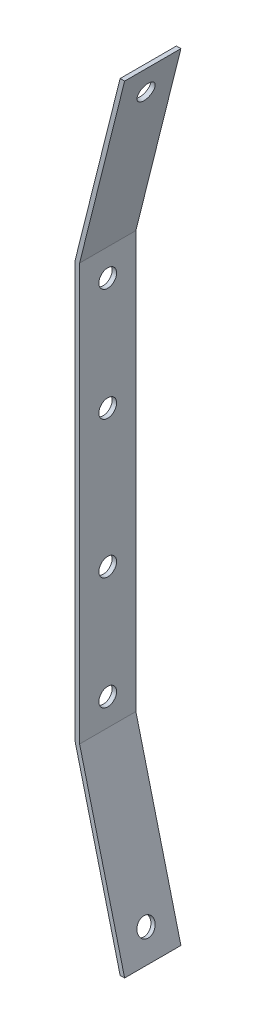
ISO-10303-21;
HEADER;
FILE_DESCRIPTION(('STEP AP214'),'2;1');
FILE_NAME('part.step','',(''),(''),'','','');
FILE_SCHEMA(('AUTOMOTIVE_DESIGN { 1 0 10303 214 1 1 1 1 }'));
ENDSEC;
DATA;
#1=APPLICATION_CONTEXT('core data for automotive mechanical design processes');
#2=APPLICATION_PROTOCOL_DEFINITION('international standard','automotive_design',2000,#1);
#3=PRODUCT_CONTEXT('',#1,'mechanical');
#4=PRODUCT('Part','Part','',(#3));
#5=PRODUCT_RELATED_PRODUCT_CATEGORY('part','',(#4));
#6=PRODUCT_DEFINITION_FORMATION('','',#4);
#7=PRODUCT_DEFINITION_CONTEXT('part definition',#1,'design');
#8=PRODUCT_DEFINITION('design','',#6,#7);
#9=PRODUCT_DEFINITION_SHAPE('','',#8);
#10=(LENGTH_UNIT() NAMED_UNIT(*) SI_UNIT(.MILLI.,.METRE.));
#11=(NAMED_UNIT(*) PLANE_ANGLE_UNIT() SI_UNIT($,.RADIAN.));
#12=(NAMED_UNIT(*) SI_UNIT($,.STERADIAN.) SOLID_ANGLE_UNIT());
#13=UNCERTAINTY_MEASURE_WITH_UNIT(LENGTH_MEASURE(1.E-05),#10,'distance_accuracy_value','');
#14=(GEOMETRIC_REPRESENTATION_CONTEXT(3) GLOBAL_UNCERTAINTY_ASSIGNED_CONTEXT((#13)) GLOBAL_UNIT_ASSIGNED_CONTEXT((#10,
#11,#12)) REPRESENTATION_CONTEXT('',''));
#15=CARTESIAN_POINT('',(0.,0.,0.));
#16=DIRECTION('',(0.,0.,1.));
#17=DIRECTION('',(1.,0.,0.));
#18=AXIS2_PLACEMENT_3D('',#15,#16,#17);
#19=CARTESIAN_POINT('',(0.,0.,6.35));
#20=DIRECTION('',(-1.,0.,0.));
#21=DIRECTION('',(0.,0.,1.));
#22=AXIS2_PLACEMENT_3D('',#19,#20,#21);
#23=PLANE('',#22);
#24=CARTESIAN_POINT('',(0.,15.748,3.175));
#25=DIRECTION('',(-1.,0.,0.));
#26=DIRECTION('',(0.,0.,1.));
#27=AXIS2_PLACEMENT_3D('',#24,#25,#26);
#28=CIRCLE('',#27,1.);
#29=CARTESIAN_POINT('',(0.,15.748,4.175));
#30=VERTEX_POINT('',#29);
#31=EDGE_CURVE('E165',#30,#30,#28,.T.);
#32=ORIENTED_EDGE('',*,*,#31,.F.);
#33=EDGE_LOOP('',(#32));
#34=FACE_BOUND('',#33,.T.);
#35=CARTESIAN_POINT('',(0.,43.942,3.175));
#36=DIRECTION('',(-1.,0.,0.));
#37=DIRECTION('',(0.,0.,1.));
#38=AXIS2_PLACEMENT_3D('',#35,#36,#37);
#39=CIRCLE('',#38,1.);
#40=CARTESIAN_POINT('',(0.,43.942,4.175));
#41=VERTEX_POINT('',#40);
#42=EDGE_CURVE('E225',#41,#41,#39,.T.);
#43=ORIENTED_EDGE('',*,*,#42,.F.);
#44=EDGE_LOOP('',(#43));
#45=FACE_BOUND('',#44,.T.);
#46=CARTESIAN_POINT('',(0.,31.242,3.175));
#47=DIRECTION('',(-1.,0.,0.));
#48=DIRECTION('',(0.,0.,1.));
#49=AXIS2_PLACEMENT_3D('',#46,#47,#48);
#50=CIRCLE('',#49,0.999999999999999);
#51=CARTESIAN_POINT('',(0.,31.242,4.175));
#52=VERTEX_POINT('',#51);
#53=EDGE_CURVE('E178',#52,#52,#50,.T.);
#54=ORIENTED_EDGE('',*,*,#53,.F.);
#55=EDGE_LOOP('',(#54));
#56=FACE_BOUND('',#55,.T.);
#57=CARTESIAN_POINT('',(0.,3.048,3.175));
#58=DIRECTION('',(-1.,0.,0.));
#59=DIRECTION('',(0.,0.,1.));
#60=AXIS2_PLACEMENT_3D('',#57,#58,#59);
#61=CIRCLE('',#60,1.);
#62=CARTESIAN_POINT('',(0.,3.048,4.175));
#63=VERTEX_POINT('',#62);
#64=EDGE_CURVE('E161',#63,#63,#61,.T.);
#65=ORIENTED_EDGE('',*,*,#64,.F.);
#66=EDGE_LOOP('',(#65));
#67=FACE_BOUND('',#66,.T.);
#68=DIRECTION('',(0.,1.,0.));
#69=VECTOR('',#68,1.);
#70=CARTESIAN_POINT('',(0.,0.,0.));
#71=LINE('',#70,#69);
#72=CARTESIAN_POINT('',(0.,0.,0.));
#73=VERTEX_POINT('',#72);
#74=CARTESIAN_POINT('',(0.,46.99,0.));
#75=VERTEX_POINT('',#74);
#76=EDGE_CURVE('E130',#73,#75,#71,.T.);
#77=ORIENTED_EDGE('',*,*,#76,.F.);
#78=DIRECTION('',(0.,0.,-1.));
#79=VECTOR('',#78,1.);
#80=CARTESIAN_POINT('',(0.,0.,6.35));
#81=LINE('',#80,#79);
#82=CARTESIAN_POINT('',(0.,0.,6.35));
#83=VERTEX_POINT('',#82);
#84=EDGE_CURVE('E11',#83,#73,#81,.T.);
#85=ORIENTED_EDGE('',*,*,#84,.F.);
#86=DIRECTION('',(0.,1.,0.));
#87=VECTOR('',#86,1.);
#88=CARTESIAN_POINT('',(0.,0.,6.35));
#89=LINE('',#88,#87);
#90=CARTESIAN_POINT('',(0.,46.99,6.35));
#91=VERTEX_POINT('',#90);
#92=EDGE_CURVE('E147',#83,#91,#89,.T.);
#93=ORIENTED_EDGE('',*,*,#92,.T.);
#94=DIRECTION('',(0.,0.,-1.));
#95=VECTOR('',#94,1.);
#96=CARTESIAN_POINT('',(0.,46.99,6.35));
#97=LINE('',#96,#95);
#98=EDGE_CURVE('E52',#91,#75,#97,.T.);
#99=ORIENTED_EDGE('',*,*,#98,.T.);
#100=EDGE_LOOP('',(#77,#85,#93,#99));
#101=FACE_BOUND('',#100,.T.);
#102=ADVANCED_FACE('F34',(#34,#45,#56,#67,#101),#23,.T.);
#103=CARTESIAN_POINT('',(0.,0.,6.35));
#104=DIRECTION('',(0.970142500145332,0.242535625036333,0.));
#105=DIRECTION('',(-0.242535625036333,0.970142500145332,0.));
#106=AXIS2_PLACEMENT_3D('',#103,#104,#105);
#107=PLANE('',#106);
#108=CARTESIAN_POINT('',(4.352393124891,-17.409572499564,3.175));
#109=DIRECTION('',(0.970142500145332,0.242535625036333,0.));
#110=DIRECTION('',(-0.242535625036333,0.970142500145332,0.));
#111=AXIS2_PLACEMENT_3D('',#108,#109,#110);
#112=CIRCLE('',#111,1.);
#113=CARTESIAN_POINT('',(4.10985749985467,-16.4394299994187,3.175));
#114=VERTEX_POINT('',#113);
#115=EDGE_CURVE('E237',#114,#114,#112,.T.);
#116=ORIENTED_EDGE('',*,*,#115,.T.);
#117=EDGE_LOOP('',(#116));
#118=FACE_BOUND('',#117,.T.);
#119=DIRECTION('',(0.242535625036333,-0.970142500145332,0.));
#120=VECTOR('',#119,1.);
#121=CARTESIAN_POINT('',(0.,0.,0.));
#122=LINE('',#121,#120);
#123=CARTESIAN_POINT('',(5.08,-20.32,0.));
#124=VERTEX_POINT('',#123);
#125=EDGE_CURVE('E132',#73,#124,#122,.T.);
#126=ORIENTED_EDGE('',*,*,#125,.T.);
#127=DIRECTION('',(0.,0.,-1.));
#128=VECTOR('',#127,1.);
#129=CARTESIAN_POINT('',(5.08,-20.32,6.35));
#130=LINE('',#129,#128);
#131=CARTESIAN_POINT('',(5.08,-20.32,6.35));
#132=VERTEX_POINT('',#131);
#133=EDGE_CURVE('E43',#132,#124,#130,.T.);
#134=ORIENTED_EDGE('',*,*,#133,.F.);
#135=DIRECTION('',(0.242535625036333,-0.970142500145332,0.));
#136=VECTOR('',#135,1.);
#137=CARTESIAN_POINT('',(0.,0.,6.35));
#138=LINE('',#137,#136);
#139=EDGE_CURVE('E181',#83,#132,#138,.T.);
#140=ORIENTED_EDGE('',*,*,#139,.F.);
#141=ORIENTED_EDGE('',*,*,#84,.T.);
#142=EDGE_LOOP('',(#126,#134,#140,#141));
#143=FACE_BOUND('',#142,.T.);
#144=ADVANCED_FACE('F212',(#118,#143),#107,.F.);
#145=CARTESIAN_POINT('',(0.,-20.32,6.35));
#146=DIRECTION('',(0.,1.,0.));
#147=DIRECTION('',(0.,0.,1.));
#148=AXIS2_PLACEMENT_3D('',#145,#146,#147);
#149=PLANE('',#148);
#150=DIRECTION('',(1.,0.,0.));
#151=VECTOR('',#150,1.);
#152=CARTESIAN_POINT('',(0.,-20.32,0.));
#153=LINE('',#152,#151);
#154=CARTESIAN_POINT('',(5.588,-20.32,0.));
#155=VERTEX_POINT('',#154);
#156=EDGE_CURVE('E135',#124,#155,#153,.T.);
#157=ORIENTED_EDGE('',*,*,#156,.T.);
#158=DIRECTION('',(0.,0.,-1.));
#159=VECTOR('',#158,1.);
#160=CARTESIAN_POINT('',(5.588,-20.32,6.35));
#161=LINE('',#160,#159);
#162=CARTESIAN_POINT('',(5.588,-20.32,6.35));
#163=VERTEX_POINT('',#162);
#164=EDGE_CURVE('E154',#163,#155,#161,.T.);
#165=ORIENTED_EDGE('',*,*,#164,.F.);
#166=DIRECTION('',(1.,0.,0.));
#167=VECTOR('',#166,1.);
#168=CARTESIAN_POINT('',(0.,-20.32,6.35));
#169=LINE('',#168,#167);
#170=EDGE_CURVE('E183',#132,#163,#169,.T.);
#171=ORIENTED_EDGE('',*,*,#170,.F.);
#172=ORIENTED_EDGE('',*,*,#133,.T.);
#173=EDGE_LOOP('',(#157,#165,#171,#172));
#174=FACE_BOUND('',#173,.T.);
#175=ADVANCED_FACE('F217',(#174),#149,.F.);
#176=CARTESIAN_POINT('',(0.478117647058824,0.119529411764706,6.35));
#177=DIRECTION('',(-0.970142500145332,-0.242535625036333,0.));
#178=DIRECTION('',(0.242535625036333,-0.970142500145332,0.));
#179=AXIS2_PLACEMENT_3D('',#176,#177,#178);
#180=PLANE('',#179);
#181=CARTESIAN_POINT('',(4.83051077194983,-17.2900430877993,3.175));
#182=DIRECTION('',(0.970142500145332,0.242535625036333,0.));
#183=DIRECTION('',(-0.242535625036333,0.970142500145332,0.));
#184=AXIS2_PLACEMENT_3D('',#181,#182,#183);
#185=CIRCLE('',#184,1.);
#186=CARTESIAN_POINT('',(4.58797514691349,-16.319900587654,3.175));
#187=VERTEX_POINT('',#186);
#188=EDGE_CURVE('E341',#187,#187,#185,.T.);
#189=ORIENTED_EDGE('',*,*,#188,.F.);
#190=EDGE_LOOP('',(#189));
#191=FACE_BOUND('',#190,.T.);
#192=DIRECTION('',(-0.242535625036333,0.970142500145332,0.));
#193=VECTOR('',#192,1.);
#194=CARTESIAN_POINT('',(0.478117647058824,0.119529411764706,0.));
#195=LINE('',#194,#193);
#196=CARTESIAN_POINT('',(0.508,0.,0.));
#197=VERTEX_POINT('',#196);
#198=EDGE_CURVE('E137',#155,#197,#195,.T.);
#199=ORIENTED_EDGE('',*,*,#198,.T.);
#200=DIRECTION('',(0.,0.,-1.));
#201=VECTOR('',#200,1.);
#202=CARTESIAN_POINT('',(0.508,0.,6.35));
#203=LINE('',#202,#201);
#204=CARTESIAN_POINT('',(0.508,0.,6.35));
#205=VERTEX_POINT('',#204);
#206=EDGE_CURVE('E151',#205,#197,#203,.T.);
#207=ORIENTED_EDGE('',*,*,#206,.F.);
#208=DIRECTION('',(-0.242535625036333,0.970142500145332,0.));
#209=VECTOR('',#208,1.);
#210=CARTESIAN_POINT('',(0.478117647058824,0.119529411764706,6.35));
#211=LINE('',#210,#209);
#212=EDGE_CURVE('E185',#163,#205,#211,.T.);
#213=ORIENTED_EDGE('',*,*,#212,.F.);
#214=ORIENTED_EDGE('',*,*,#164,.T.);
#215=EDGE_LOOP('',(#199,#207,#213,#214));
#216=FACE_BOUND('',#215,.T.);
#217=ADVANCED_FACE('F191',(#191,#216),#180,.F.);
#218=CARTESIAN_POINT('',(0.508,0.,6.35));
#219=DIRECTION('',(-1.,0.,0.));
#220=DIRECTION('',(0.,0.,1.));
#221=AXIS2_PLACEMENT_3D('',#218,#219,#220);
#222=PLANE('',#221);
#223=CARTESIAN_POINT('',(0.508,15.748,3.175));
#224=DIRECTION('',(-1.,0.,0.));
#225=DIRECTION('',(0.,0.,1.));
#226=AXIS2_PLACEMENT_3D('',#223,#224,#225);
#227=CIRCLE('',#226,1.);
#228=CARTESIAN_POINT('',(0.508,15.748,4.175));
#229=VERTEX_POINT('',#228);
#230=EDGE_CURVE('E37',#229,#229,#227,.T.);
#231=ORIENTED_EDGE('',*,*,#230,.T.);
#232=EDGE_LOOP('',(#231));
#233=FACE_BOUND('',#232,.T.);
#234=CARTESIAN_POINT('',(0.508,43.942,3.175));
#235=DIRECTION('',(-1.,0.,0.));
#236=DIRECTION('',(0.,0.,1.));
#237=AXIS2_PLACEMENT_3D('',#234,#235,#236);
#238=CIRCLE('',#237,1.);
#239=CARTESIAN_POINT('',(0.508,43.942,4.175));
#240=VERTEX_POINT('',#239);
#241=EDGE_CURVE('E164',#240,#240,#238,.T.);
#242=ORIENTED_EDGE('',*,*,#241,.T.);
#243=EDGE_LOOP('',(#242));
#244=FACE_BOUND('',#243,.T.);
#245=CARTESIAN_POINT('',(0.508,31.242,3.175));
#246=DIRECTION('',(-1.,0.,0.));
#247=DIRECTION('',(0.,0.,1.));
#248=AXIS2_PLACEMENT_3D('',#245,#246,#247);
#249=CIRCLE('',#248,0.999999999999999);
#250=CARTESIAN_POINT('',(0.508,31.242,4.175));
#251=VERTEX_POINT('',#250);
#252=EDGE_CURVE('E162',#251,#251,#249,.T.);
#253=ORIENTED_EDGE('',*,*,#252,.T.);
#254=EDGE_LOOP('',(#253));
#255=FACE_BOUND('',#254,.T.);
#256=CARTESIAN_POINT('',(0.508,3.048,3.175));
#257=DIRECTION('',(-1.,0.,0.));
#258=DIRECTION('',(0.,0.,1.));
#259=AXIS2_PLACEMENT_3D('',#256,#257,#258);
#260=CIRCLE('',#259,1.);
#261=CARTESIAN_POINT('',(0.508,3.048,4.175));
#262=VERTEX_POINT('',#261);
#263=EDGE_CURVE('E133',#262,#262,#260,.T.);
#264=ORIENTED_EDGE('',*,*,#263,.T.);
#265=EDGE_LOOP('',(#264));
#266=FACE_BOUND('',#265,.T.);
#267=DIRECTION('',(0.,1.,0.));
#268=VECTOR('',#267,1.);
#269=CARTESIAN_POINT('',(0.508,0.,0.));
#270=LINE('',#269,#268);
#271=CARTESIAN_POINT('',(0.508,46.99,0.));
#272=VERTEX_POINT('',#271);
#273=EDGE_CURVE('E139',#197,#272,#270,.T.);
#274=ORIENTED_EDGE('',*,*,#273,.T.);
#275=DIRECTION('',(0.,0.,-1.));
#276=VECTOR('',#275,1.);
#277=CARTESIAN_POINT('',(0.508,46.99,6.35));
#278=LINE('',#277,#276);
#279=CARTESIAN_POINT('',(0.508,46.99,6.35));
#280=VERTEX_POINT('',#279);
#281=EDGE_CURVE('E122',#280,#272,#278,.T.);
#282=ORIENTED_EDGE('',*,*,#281,.F.);
#283=DIRECTION('',(0.,1.,0.));
#284=VECTOR('',#283,1.);
#285=CARTESIAN_POINT('',(0.508,0.,6.35));
#286=LINE('',#285,#284);
#287=EDGE_CURVE('E110',#205,#280,#286,.T.);
#288=ORIENTED_EDGE('',*,*,#287,.F.);
#289=ORIENTED_EDGE('',*,*,#206,.T.);
#290=EDGE_LOOP('',(#274,#282,#288,#289));
#291=FACE_BOUND('',#290,.T.);
#292=ADVANCED_FACE('F195',(#233,#244,#255,#266,#291),#222,.F.);
#293=CARTESIAN_POINT('',(-10.5783529411765,2.64458823529412,6.35));
#294=DIRECTION('',(-0.970142500145332,0.242535625036333,0.));
#295=DIRECTION('',(-0.242535625036333,-0.970142500145332,0.));
#296=AXIS2_PLACEMENT_3D('',#293,#294,#295);
#297=PLANE('',#296);
#298=CARTESIAN_POINT('',(4.83051077194983,64.2800430877993,3.175));
#299=DIRECTION('',(-0.970142500145332,0.242535625036333,0.));
#300=DIRECTION('',(-0.242535625036333,-0.970142500145332,0.));
#301=AXIS2_PLACEMENT_3D('',#298,#299,#300);
#302=CIRCLE('',#301,0.999999999999999);
#303=CARTESIAN_POINT('',(4.5879751469135,63.309900587654,3.175));
#304=VERTEX_POINT('',#303);
#305=EDGE_CURVE('E230',#304,#304,#302,.T.);
#306=ORIENTED_EDGE('',*,*,#305,.T.);
#307=EDGE_LOOP('',(#306));
#308=FACE_BOUND('',#307,.T.);
#309=DIRECTION('',(0.242535625036333,0.970142500145332,0.));
#310=VECTOR('',#309,1.);
#311=CARTESIAN_POINT('',(-10.5783529411765,2.64458823529412,0.));
#312=LINE('',#311,#310);
#313=CARTESIAN_POINT('',(5.588,67.31,0.));
#314=VERTEX_POINT('',#313);
#315=EDGE_CURVE('E119',#272,#314,#312,.T.);
#316=ORIENTED_EDGE('',*,*,#315,.T.);
#317=DIRECTION('',(0.,0.,-1.));
#318=VECTOR('',#317,1.);
#319=CARTESIAN_POINT('',(5.588,67.31,6.35));
#320=LINE('',#319,#318);
#321=CARTESIAN_POINT('',(5.588,67.31,6.35));
#322=VERTEX_POINT('',#321);
#323=EDGE_CURVE('E116',#322,#314,#320,.T.);
#324=ORIENTED_EDGE('',*,*,#323,.F.);
#325=DIRECTION('',(0.242535625036333,0.970142500145332,0.));
#326=VECTOR('',#325,1.);
#327=CARTESIAN_POINT('',(-10.5783529411765,2.64458823529412,6.35));
#328=LINE('',#327,#326);
#329=EDGE_CURVE('E102',#280,#322,#328,.T.);
#330=ORIENTED_EDGE('',*,*,#329,.F.);
#331=ORIENTED_EDGE('',*,*,#281,.T.);
#332=EDGE_LOOP('',(#316,#324,#330,#331));
#333=FACE_BOUND('',#332,.T.);
#334=ADVANCED_FACE('F117',(#308,#333),#297,.F.);
#335=CARTESIAN_POINT('',(1.67164262230492E-13,67.31,6.35));
#336=DIRECTION('',(0.,-1.,0.));
#337=DIRECTION('',(1.,0.,0.));
#338=AXIS2_PLACEMENT_3D('',#335,#336,#337);
#339=PLANE('',#338);
#340=DIRECTION('',(-1.,0.,0.));
#341=VECTOR('',#340,1.);
#342=CARTESIAN_POINT('',(1.67164262230492E-13,67.31,0.));
#343=LINE('',#342,#341);
#344=CARTESIAN_POINT('',(5.08000000000001,67.31,0.));
#345=VERTEX_POINT('',#344);
#346=EDGE_CURVE('E142',#314,#345,#343,.T.);
#347=ORIENTED_EDGE('',*,*,#346,.T.);
#348=DIRECTION('',(0.,0.,-1.));
#349=VECTOR('',#348,1.);
#350=CARTESIAN_POINT('',(5.08000000000001,67.31,6.35));
#351=LINE('',#350,#349);
#352=CARTESIAN_POINT('',(5.08000000000001,67.31,6.35));
#353=VERTEX_POINT('',#352);
#354=EDGE_CURVE('E78',#353,#345,#351,.T.);
#355=ORIENTED_EDGE('',*,*,#354,.F.);
#356=DIRECTION('',(-1.,0.,0.));
#357=VECTOR('',#356,1.);
#358=CARTESIAN_POINT('',(1.67164262230492E-13,67.31,6.35));
#359=LINE('',#358,#357);
#360=EDGE_CURVE('E108',#322,#353,#359,.T.);
#361=ORIENTED_EDGE('',*,*,#360,.F.);
#362=ORIENTED_EDGE('',*,*,#323,.T.);
#363=EDGE_LOOP('',(#347,#355,#361,#362));
#364=FACE_BOUND('',#363,.T.);
#365=ADVANCED_FACE('F124',(#364),#339,.F.);
#366=CARTESIAN_POINT('',(-11.0564705882353,2.76411764705883,6.35));
#367=DIRECTION('',(-0.970142500145332,0.242535625036333,0.));
#368=DIRECTION('',(-0.242535625036333,-0.970142500145332,0.));
#369=AXIS2_PLACEMENT_3D('',#366,#367,#368);
#370=PLANE('',#369);
#371=CARTESIAN_POINT('',(4.35239312489101,64.399572499564,3.175));
#372=DIRECTION('',(-0.970142500145332,0.242535625036333,0.));
#373=DIRECTION('',(-0.242535625036333,-0.970142500145332,0.));
#374=AXIS2_PLACEMENT_3D('',#371,#372,#373);
#375=CIRCLE('',#374,0.999999999999999);
#376=CARTESIAN_POINT('',(4.10985749985467,63.4294299994187,3.175));
#377=VERTEX_POINT('',#376);
#378=EDGE_CURVE('E232',#377,#377,#375,.T.);
#379=ORIENTED_EDGE('',*,*,#378,.F.);
#380=EDGE_LOOP('',(#379));
#381=FACE_BOUND('',#380,.T.);
#382=DIRECTION('',(0.242535625036333,0.970142500145332,0.));
#383=VECTOR('',#382,1.);
#384=CARTESIAN_POINT('',(-11.0564705882353,2.76411764705883,0.));
#385=LINE('',#384,#383);
#386=EDGE_CURVE('E144',#75,#345,#385,.T.);
#387=ORIENTED_EDGE('',*,*,#386,.F.);
#388=ORIENTED_EDGE('',*,*,#98,.F.);
#389=DIRECTION('',(0.242535625036333,0.970142500145332,0.));
#390=VECTOR('',#389,1.);
#391=CARTESIAN_POINT('',(-11.0564705882353,2.76411764705883,6.35));
#392=LINE('',#391,#390);
#393=EDGE_CURVE('E125',#91,#353,#392,.T.);
#394=ORIENTED_EDGE('',*,*,#393,.T.);
#395=ORIENTED_EDGE('',*,*,#354,.T.);
#396=EDGE_LOOP('',(#387,#388,#394,#395));
#397=FACE_BOUND('',#396,.T.);
#398=ADVANCED_FACE('F199',(#381,#397),#370,.T.);
#399=CARTESIAN_POINT('',(0.,0.,6.35));
#400=DIRECTION('',(0.,0.,1.));
#401=DIRECTION('',(1.,0.,0.));
#402=AXIS2_PLACEMENT_3D('',#399,#400,#401);
#403=PLANE('',#402);
#404=ORIENTED_EDGE('',*,*,#92,.F.);
#405=ORIENTED_EDGE('',*,*,#139,.T.);
#406=ORIENTED_EDGE('',*,*,#170,.T.);
#407=ORIENTED_EDGE('',*,*,#212,.T.);
#408=ORIENTED_EDGE('',*,*,#287,.T.);
#409=ORIENTED_EDGE('',*,*,#329,.T.);
#410=ORIENTED_EDGE('',*,*,#360,.T.);
#411=ORIENTED_EDGE('',*,*,#393,.F.);
#412=EDGE_LOOP('',(#404,#405,#406,#407,#408,#409,#410,#411));
#413=FACE_BOUND('',#412,.T.);
#414=ADVANCED_FACE('F105',(#413),#403,.T.);
#415=CARTESIAN_POINT('',(0.,0.,0.));
#416=DIRECTION('',(0.,0.,1.));
#417=DIRECTION('',(1.,0.,0.));
#418=AXIS2_PLACEMENT_3D('',#415,#416,#417);
#419=PLANE('',#418);
#420=ORIENTED_EDGE('',*,*,#76,.T.);
#421=ORIENTED_EDGE('',*,*,#386,.T.);
#422=ORIENTED_EDGE('',*,*,#346,.F.);
#423=ORIENTED_EDGE('',*,*,#315,.F.);
#424=ORIENTED_EDGE('',*,*,#273,.F.);
#425=ORIENTED_EDGE('',*,*,#198,.F.);
#426=ORIENTED_EDGE('',*,*,#156,.F.);
#427=ORIENTED_EDGE('',*,*,#125,.F.);
#428=EDGE_LOOP('',(#420,#421,#422,#423,#424,#425,#426,#427));
#429=FACE_BOUND('',#428,.T.);
#430=ADVANCED_FACE('F197',(#429),#419,.F.);
#431=CARTESIAN_POINT('',(6.35,3.048,3.175));
#432=DIRECTION('',(-1.,0.,0.));
#433=DIRECTION('',(0.,0.,1.));
#434=AXIS2_PLACEMENT_3D('',#431,#432,#433);
#435=CYLINDRICAL_SURFACE('',#434,1.);
#436=ORIENTED_EDGE('',*,*,#64,.T.);
#437=EDGE_LOOP('',(#436));
#438=FACE_BOUND('',#437,.T.);
#439=ORIENTED_EDGE('',*,*,#263,.F.);
#440=EDGE_LOOP('',(#439));
#441=FACE_BOUND('',#440,.T.);
#442=ADVANCED_FACE('F262',(#438,#441),#435,.F.);
#443=CARTESIAN_POINT('',(6.35,31.242,3.175));
#444=DIRECTION('',(-1.,0.,0.));
#445=DIRECTION('',(0.,0.,1.));
#446=AXIS2_PLACEMENT_3D('',#443,#444,#445);
#447=CYLINDRICAL_SURFACE('',#446,0.999999999999999);
#448=ORIENTED_EDGE('',*,*,#53,.T.);
#449=EDGE_LOOP('',(#448));
#450=FACE_BOUND('',#449,.T.);
#451=ORIENTED_EDGE('',*,*,#252,.F.);
#452=EDGE_LOOP('',(#451));
#453=FACE_BOUND('',#452,.T.);
#454=ADVANCED_FACE('F255',(#450,#453),#447,.F.);
#455=CARTESIAN_POINT('',(6.35,43.942,3.175));
#456=DIRECTION('',(-1.,0.,0.));
#457=DIRECTION('',(0.,0.,1.));
#458=AXIS2_PLACEMENT_3D('',#455,#456,#457);
#459=CYLINDRICAL_SURFACE('',#458,1.);
#460=ORIENTED_EDGE('',*,*,#42,.T.);
#461=EDGE_LOOP('',(#460));
#462=FACE_BOUND('',#461,.T.);
#463=ORIENTED_EDGE('',*,*,#241,.F.);
#464=EDGE_LOOP('',(#463));
#465=FACE_BOUND('',#464,.T.);
#466=ADVANCED_FACE('F246',(#462,#465),#459,.F.);
#467=CARTESIAN_POINT('',(6.35,15.748,3.175));
#468=DIRECTION('',(-1.,0.,0.));
#469=DIRECTION('',(0.,0.,1.));
#470=AXIS2_PLACEMENT_3D('',#467,#468,#469);
#471=CYLINDRICAL_SURFACE('',#470,1.);
#472=ORIENTED_EDGE('',*,*,#31,.T.);
#473=EDGE_LOOP('',(#472));
#474=FACE_BOUND('',#473,.T.);
#475=ORIENTED_EDGE('',*,*,#230,.F.);
#476=EDGE_LOOP('',(#475));
#477=FACE_BOUND('',#476,.T.);
#478=ADVANCED_FACE('F242',(#474,#477),#471,.F.);
#479=CARTESIAN_POINT('',(10.5127980008139,62.8594712805833,3.175));
#480=DIRECTION('',(-0.970142500145332,0.242535625036333,0.));
#481=DIRECTION('',(-0.242535625036333,-0.970142500145332,0.));
#482=AXIS2_PLACEMENT_3D('',#479,#480,#481);
#483=CYLINDRICAL_SURFACE('',#482,0.999999999999999);
#484=ORIENTED_EDGE('',*,*,#378,.T.);
#485=EDGE_LOOP('',(#484));
#486=FACE_BOUND('',#485,.T.);
#487=ORIENTED_EDGE('',*,*,#305,.F.);
#488=EDGE_LOOP('',(#487));
#489=FACE_BOUND('',#488,.T.);
#490=ADVANCED_FACE('F245',(#486,#489),#483,.F.);
#491=CARTESIAN_POINT('',(2.36634882158068,-17.9060835753916,3.175));
#492=DIRECTION('',(0.970142500145332,0.242535625036333,0.));
#493=DIRECTION('',(-0.242535625036333,0.970142500145332,0.));
#494=AXIS2_PLACEMENT_3D('',#491,#492,#493);
#495=CYLINDRICAL_SURFACE('',#494,1.);
#496=CARTESIAN_POINT('',(4.58797514691349,-16.319900587654,3.175));
#497=CARTESIAN_POINT('',(4.58299475475663,-16.3211456856932,3.175));
#498=CARTESIAN_POINT('',(4.57801436259977,-16.3223907837324,3.175));
#499=CARTESIAN_POINT('',(4.56805357828604,-16.3248809798108,3.175));
#500=CARTESIAN_POINT('',(4.56307318612918,-16.32612607785,3.175));
#501=CARTESIAN_POINT('',(4.55311240181546,-16.3286162739285,3.175));
#502=CARTESIAN_POINT('',(4.54813200965859,-16.3298613719677,3.175));
#503=CARTESIAN_POINT('',(4.53817122534487,-16.3323515680461,3.175));
#504=CARTESIAN_POINT('',(4.533190833188,-16.3335966660853,3.175));
#505=CARTESIAN_POINT('',(4.52323004887428,-16.3360868621638,3.175));
#506=CARTESIAN_POINT('',(4.51824965671741,-16.337331960203,3.175));
#507=CARTESIAN_POINT('',(4.50828887240369,-16.3398221562814,3.175));
#508=CARTESIAN_POINT('',(4.50330848024683,-16.3410672543206,3.175));
#509=CARTESIAN_POINT('',(4.4933476959331,-16.3435574503991,3.175));
#510=CARTESIAN_POINT('',(4.48836730377624,-16.3448025484383,3.175));
#511=CARTESIAN_POINT('',(4.47840651946251,-16.3472927445167,3.175));
#512=CARTESIAN_POINT('',(4.47342612730565,-16.3485378425559,3.175));
#513=CARTESIAN_POINT('',(4.46346534299192,-16.3510280386344,3.175));
#514=CARTESIAN_POINT('',(4.45848495083506,-16.3522731366736,3.175));
#515=CARTESIAN_POINT('',(4.44852416652134,-16.354763332752,3.175));
#516=CARTESIAN_POINT('',(4.44354377436447,-16.3560084307912,3.175));
#517=CARTESIAN_POINT('',(4.43358299005075,-16.3584986268697,3.175));
#518=CARTESIAN_POINT('',(4.42860259789389,-16.3597437249089,3.175));
#519=CARTESIAN_POINT('',(4.41864181358016,-16.3622339209873,3.175));
#520=CARTESIAN_POINT('',(4.4136614214233,-16.3634790190265,3.175));
#521=CARTESIAN_POINT('',(4.40370063710957,-16.365969215105,3.175));
#522=CARTESIAN_POINT('',(4.39872024495271,-16.3672143131442,3.175));
#523=CARTESIAN_POINT('',(4.38875946063898,-16.3697045092226,3.175));
#524=CARTESIAN_POINT('',(4.38377906848212,-16.3709496072618,3.175));
#525=CARTESIAN_POINT('',(4.3738182841684,-16.3734398033402,3.175));
#526=CARTESIAN_POINT('',(4.36883789201153,-16.3746849013795,3.175));
#527=CARTESIAN_POINT('',(4.35887710769781,-16.3771750974579,3.175));
#528=CARTESIAN_POINT('',(4.35389671554094,-16.3784201954971,3.175));
#529=CARTESIAN_POINT('',(4.34393593122722,-16.3809103915755,3.175));
#530=CARTESIAN_POINT('',(4.33895553907036,-16.3821554896148,3.175));
#531=CARTESIAN_POINT('',(4.32899475475663,-16.3846456856932,3.175));
#532=CARTESIAN_POINT('',(4.32401436259977,-16.3858907837324,3.175));
#533=CARTESIAN_POINT('',(4.31405357828604,-16.3883809798108,3.175));
#534=CARTESIAN_POINT('',(4.30907318612918,-16.38962607785,3.175));
#535=CARTESIAN_POINT('',(4.29911240181545,-16.3921162739285,3.175));
#536=CARTESIAN_POINT('',(4.29413200965859,-16.3933613719677,3.175));
#537=CARTESIAN_POINT('',(4.28417122534487,-16.3958515680461,3.175));
#538=CARTESIAN_POINT('',(4.279190833188,-16.3970966660853,3.175));
#539=CARTESIAN_POINT('',(4.26923004887428,-16.3995868621638,3.175));
#540=CARTESIAN_POINT('',(4.26424965671742,-16.400831960203,3.175));
#541=CARTESIAN_POINT('',(4.25428887240369,-16.4033221562814,3.175));
#542=CARTESIAN_POINT('',(4.24930848024683,-16.4045672543206,3.175));
#543=CARTESIAN_POINT('',(4.2393476959331,-16.4070574503991,3.175));
#544=CARTESIAN_POINT('',(4.23436730377624,-16.4083025484383,3.175));
#545=CARTESIAN_POINT('',(4.22440651946251,-16.4107927445167,3.175));
#546=CARTESIAN_POINT('',(4.21942612730565,-16.4120378425559,3.175));
#547=CARTESIAN_POINT('',(4.20946534299192,-16.4145280386344,3.175));
#548=CARTESIAN_POINT('',(4.20448495083506,-16.4157731366736,3.175));
#549=CARTESIAN_POINT('',(4.19452416652134,-16.418263332752,3.175));
#550=CARTESIAN_POINT('',(4.18954377436447,-16.4195084307912,3.175));
#551=CARTESIAN_POINT('',(4.17958299005075,-16.4219986268697,3.175));
#552=CARTESIAN_POINT('',(4.17460259789389,-16.4232437249089,3.175));
#553=CARTESIAN_POINT('',(4.16464181358016,-16.4257339209873,3.175));
#554=CARTESIAN_POINT('',(4.1596614214233,-16.4269790190265,3.175));
#555=CARTESIAN_POINT('',(4.14970063710957,-16.4294692151049,3.175));
#556=CARTESIAN_POINT('',(4.14472024495271,-16.4307143131442,3.175));
#557=CARTESIAN_POINT('',(4.13475946063898,-16.4332045092226,3.175));
#558=CARTESIAN_POINT('',(4.12977906848212,-16.4344496072618,3.175));
#559=CARTESIAN_POINT('',(4.1198182841684,-16.4369398033402,3.175));
#560=CARTESIAN_POINT('',(4.11483789201153,-16.4381849013795,3.175));
#561=CARTESIAN_POINT('',(4.10985749985467,-16.4394299994187,3.175));
#562=B_SPLINE_CURVE_WITH_KNOTS('',3,(#496,#497,#498,#499,#500,#501,#502,#503,#504,#505,#506,
#507,#508,#509,#510,#511,#512,#513,#514,#515,#516,#517,#518,#519,#520,#521,#522,#523,#524,#525,
#526,#527,#528,#529,#530,#531,#532,#533,#534,#535,#536,#537,#538,#539,#540,#541,#542,#543,#544,
#545,#546,#547,#548,#549,#550,#551,#552,#553,#554,#555,#556,#557,#558,#559,#560,#561),
.UNSPECIFIED.,.F.,.F.,(4,2,2,2,2,2,2,2,2,2,2,2,2,2,2,2,2,2,2,2,2,2,2,2,2,2,2,2,2,2,2,2,4),(0.,
0.0154010121898066,0.030802024379614,0.0462030365694214,0.0616040487592288,0.0770050609490353,
0.0924060731388427,0.107807085328649,0.123208097518458,0.138609109708264,0.154010121898071,
0.169411134087878,0.184812146277685,0.200213158467492,0.2156141706573,0.231015182847107,
0.246416195036914,0.261817207226721,0.277218219416528,0.292619231606336,0.308020243796143,
0.323421255985949,0.338822268175758,0.354223280365563,0.369624292555371,0.385025304745178,
0.400426316934986,0.415827329124792,0.4312283413146,0.446629353504406,0.462030365694214,
0.477431377884021,0.492832390073828),.UNSPECIFIED.);
#563=EDGE_CURVE('BSEAM252',#187,#114,#562,.T.);
#564=ORIENTED_EDGE('',*,*,#188,.T.);
#565=ORIENTED_EDGE('',*,*,#115,.F.);
#566=ORIENTED_EDGE('',*,*,#563,.T.);
#567=ORIENTED_EDGE('',*,*,#563,.F.);
#568=EDGE_LOOP('',(#564,#566,#565,#567));
#569=FACE_BOUND('',#568,.T.);
#570=ADVANCED_FACE('F252',(#569),#495,.F.);
#571=CLOSED_SHELL('',(#102,#144,#175,#217,#292,#334,#365,#398,#414,#430,#442,#454,#466,#478,
#490,#570));
#572=MANIFOLD_SOLID_BREP('B2',#571);
#573=ADVANCED_BREP_SHAPE_REPRESENTATION('',(#18,#572),#14);
#574=SHAPE_DEFINITION_REPRESENTATION(#9,#573);
ENDSEC;
END-ISO-10303-21;
